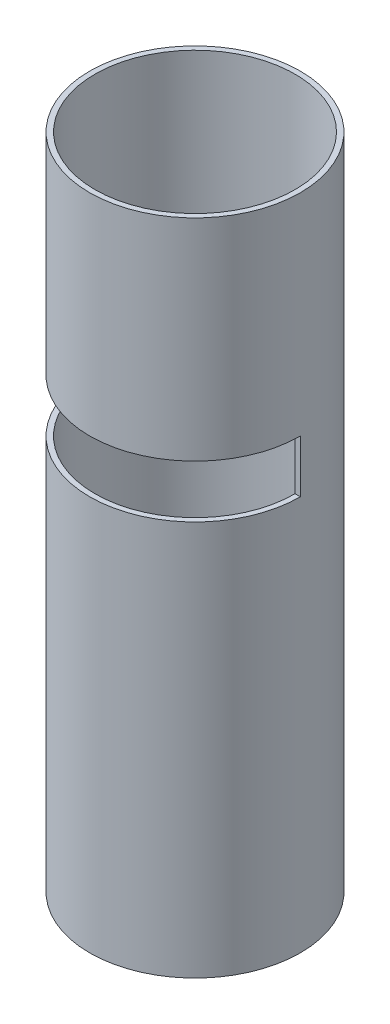
ISO-10303-21;
HEADER;
FILE_DESCRIPTION(('STEP AP214'),'2;1');
FILE_NAME('part.step','',(''),(''),'','','');
FILE_SCHEMA(('AUTOMOTIVE_DESIGN { 1 0 10303 214 1 1 1 1 }'));
ENDSEC;
DATA;
#1=APPLICATION_CONTEXT('core data for automotive mechanical design processes');
#2=APPLICATION_PROTOCOL_DEFINITION('international standard','automotive_design',2000,#1);
#3=PRODUCT_CONTEXT('',#1,'mechanical');
#4=PRODUCT('Part','Part','',(#3));
#5=PRODUCT_RELATED_PRODUCT_CATEGORY('part','',(#4));
#6=PRODUCT_DEFINITION_FORMATION('','',#4);
#7=PRODUCT_DEFINITION_CONTEXT('part definition',#1,'design');
#8=PRODUCT_DEFINITION('design','',#6,#7);
#9=PRODUCT_DEFINITION_SHAPE('','',#8);
#10=(LENGTH_UNIT() NAMED_UNIT(*) SI_UNIT(.MILLI.,.METRE.));
#11=(NAMED_UNIT(*) PLANE_ANGLE_UNIT() SI_UNIT($,.RADIAN.));
#12=(NAMED_UNIT(*) SI_UNIT($,.STERADIAN.) SOLID_ANGLE_UNIT());
#13=UNCERTAINTY_MEASURE_WITH_UNIT(LENGTH_MEASURE(1.E-05),#10,'distance_accuracy_value','');
#14=(GEOMETRIC_REPRESENTATION_CONTEXT(3) GLOBAL_UNCERTAINTY_ASSIGNED_CONTEXT((#13)) GLOBAL_UNIT_ASSIGNED_CONTEXT((#10,
#11,#12)) REPRESENTATION_CONTEXT('',''));
#15=CARTESIAN_POINT('',(0.,0.,0.));
#16=DIRECTION('',(0.,0.,1.));
#17=DIRECTION('',(1.,0.,0.));
#18=AXIS2_PLACEMENT_3D('',#15,#16,#17);
#19=CARTESIAN_POINT('',(0.,250.,0.));
#20=DIRECTION('',(0.,-1.,0.));
#21=DIRECTION('',(0.,0.,-1.));
#22=AXIS2_PLACEMENT_3D('',#19,#20,#21);
#23=CYLINDRICAL_SURFACE('',#22,40.);
#24=CARTESIAN_POINT('',(0.,250.,0.));
#25=DIRECTION('',(0.,1.,0.));
#26=DIRECTION('',(0.,0.,1.));
#27=AXIS2_PLACEMENT_3D('',#24,#25,#26);
#28=CIRCLE('',#27,40.);
#29=CARTESIAN_POINT('',(0.,250.,40.));
#30=VERTEX_POINT('',#29);
#31=EDGE_CURVE('E103',#30,#30,#28,.T.);
#32=ORIENTED_EDGE('',*,*,#31,.F.);
#33=EDGE_LOOP('',(#32));
#34=FACE_BOUND('',#33,.T.);
#35=CARTESIAN_POINT('',(0.,0.,0.));
#36=DIRECTION('',(0.,1.,0.));
#37=DIRECTION('',(0.,0.,1.));
#38=AXIS2_PLACEMENT_3D('',#35,#36,#37);
#39=CIRCLE('',#38,40.);
#40=CARTESIAN_POINT('',(0.,0.,40.));
#41=VERTEX_POINT('',#40);
#42=EDGE_CURVE('E100',#41,#41,#39,.T.);
#43=ORIENTED_EDGE('',*,*,#42,.T.);
#44=EDGE_LOOP('',(#43));
#45=FACE_BOUND('',#44,.T.);
#46=CARTESIAN_POINT('',(0.,150.,0.));
#47=DIRECTION('',(0.,1.,0.));
#48=DIRECTION('',(0.,0.,1.));
#49=AXIS2_PLACEMENT_3D('',#46,#47,#48);
#50=CIRCLE('',#49,40.);
#51=CARTESIAN_POINT('',(-40.,150.,0.));
#52=VERTEX_POINT('',#51);
#53=CARTESIAN_POINT('',(40.,150.,0.));
#54=VERTEX_POINT('',#53);
#55=EDGE_CURVE('E72',#52,#54,#50,.T.);
#56=ORIENTED_EDGE('',*,*,#55,.F.);
#57=DIRECTION('',(0.,-1.,0.));
#58=VECTOR('',#57,1.);
#59=CARTESIAN_POINT('',(-40.,170.,0.));
#60=LINE('',#59,#58);
#61=CARTESIAN_POINT('',(-40.,170.,0.));
#62=VERTEX_POINT('',#61);
#63=EDGE_CURVE('E76',#62,#52,#60,.T.);
#64=ORIENTED_EDGE('',*,*,#63,.F.);
#65=CARTESIAN_POINT('',(0.,170.,0.));
#66=DIRECTION('',(0.,-1.,0.));
#67=DIRECTION('',(0.,0.,-1.));
#68=AXIS2_PLACEMENT_3D('',#65,#66,#67);
#69=CIRCLE('',#68,40.);
#70=CARTESIAN_POINT('',(40.,170.,0.));
#71=VERTEX_POINT('',#70);
#72=EDGE_CURVE('E80',#71,#62,#69,.T.);
#73=ORIENTED_EDGE('',*,*,#72,.F.);
#74=DIRECTION('',(0.,1.,0.));
#75=VECTOR('',#74,1.);
#76=CARTESIAN_POINT('',(40.,170.,0.));
#77=LINE('',#76,#75);
#78=EDGE_CURVE('E77',#54,#71,#77,.T.);
#79=ORIENTED_EDGE('',*,*,#78,.F.);
#80=EDGE_LOOP('',(#56,#64,#73,#79));
#81=FACE_BOUND('',#80,.T.);
#82=ADVANCED_FACE('F33',(#34,#45,#81),#23,.T.);
#83=CARTESIAN_POINT('',(0.,250.,0.));
#84=DIRECTION('',(0.,-1.,0.));
#85=DIRECTION('',(0.,0.,-1.));
#86=AXIS2_PLACEMENT_3D('',#83,#84,#85);
#87=CYLINDRICAL_SURFACE('',#86,38.);
#88=CARTESIAN_POINT('',(0.,250.,0.));
#89=DIRECTION('',(0.,1.,0.));
#90=DIRECTION('',(0.,0.,1.));
#91=AXIS2_PLACEMENT_3D('',#88,#89,#90);
#92=CIRCLE('',#91,38.);
#93=CARTESIAN_POINT('',(0.,250.,38.));
#94=VERTEX_POINT('',#93);
#95=EDGE_CURVE('E97',#94,#94,#92,.T.);
#96=ORIENTED_EDGE('',*,*,#95,.T.);
#97=EDGE_LOOP('',(#96));
#98=FACE_BOUND('',#97,.T.);
#99=CARTESIAN_POINT('',(0.,0.,0.));
#100=DIRECTION('',(0.,1.,0.));
#101=DIRECTION('',(0.,0.,1.));
#102=AXIS2_PLACEMENT_3D('',#99,#100,#101);
#103=CIRCLE('',#102,38.);
#104=CARTESIAN_POINT('',(0.,0.,38.));
#105=VERTEX_POINT('',#104);
#106=EDGE_CURVE('E79',#105,#105,#103,.T.);
#107=ORIENTED_EDGE('',*,*,#106,.F.);
#108=EDGE_LOOP('',(#107));
#109=FACE_BOUND('',#108,.T.);
#110=CARTESIAN_POINT('',(0.,170.,0.));
#111=DIRECTION('',(0.,-1.,0.));
#112=DIRECTION('',(0.,0.,-1.));
#113=AXIS2_PLACEMENT_3D('',#110,#111,#112);
#114=CIRCLE('',#113,38.);
#115=CARTESIAN_POINT('',(38.,170.,0.));
#116=VERTEX_POINT('',#115);
#117=CARTESIAN_POINT('',(-38.,170.,0.));
#118=VERTEX_POINT('',#117);
#119=EDGE_CURVE('E111',#116,#118,#114,.T.);
#120=ORIENTED_EDGE('',*,*,#119,.T.);
#121=DIRECTION('',(0.,-1.,0.));
#122=VECTOR('',#121,1.);
#123=CARTESIAN_POINT('',(-38.,250.,0.));
#124=LINE('',#123,#122);
#125=CARTESIAN_POINT('',(-38.,150.,0.));
#126=VERTEX_POINT('',#125);
#127=EDGE_CURVE('E11',#118,#126,#124,.T.);
#128=ORIENTED_EDGE('',*,*,#127,.T.);
#129=CARTESIAN_POINT('',(0.,150.,0.));
#130=DIRECTION('',(0.,1.,0.));
#131=DIRECTION('',(0.,0.,1.));
#132=AXIS2_PLACEMENT_3D('',#129,#130,#131);
#133=CIRCLE('',#132,38.);
#134=CARTESIAN_POINT('',(38.,150.,0.));
#135=VERTEX_POINT('',#134);
#136=EDGE_CURVE('E40',#126,#135,#133,.T.);
#137=ORIENTED_EDGE('',*,*,#136,.T.);
#138=DIRECTION('',(0.,-1.,0.));
#139=VECTOR('',#138,1.);
#140=CARTESIAN_POINT('',(38.,250.,0.));
#141=LINE('',#140,#139);
#142=EDGE_CURVE('E106',#135,#116,#141,.F.);
#143=ORIENTED_EDGE('',*,*,#142,.T.);
#144=EDGE_LOOP('',(#120,#128,#137,#143));
#145=FACE_BOUND('',#144,.T.);
#146=ADVANCED_FACE('F114',(#98,#109,#145),#87,.F.);
#147=CARTESIAN_POINT('',(0.,250.,0.));
#148=DIRECTION('',(0.,1.,0.));
#149=DIRECTION('',(0.,0.,1.));
#150=AXIS2_PLACEMENT_3D('',#147,#148,#149);
#151=PLANE('',#150);
#152=ORIENTED_EDGE('',*,*,#31,.T.);
#153=EDGE_LOOP('',(#152));
#154=FACE_BOUND('',#153,.T.);
#155=ORIENTED_EDGE('',*,*,#95,.F.);
#156=EDGE_LOOP('',(#155));
#157=FACE_BOUND('',#156,.T.);
#158=ADVANCED_FACE('F132',(#154,#157),#151,.T.);
#159=CARTESIAN_POINT('',(0.,0.,0.));
#160=DIRECTION('',(0.,1.,0.));
#161=DIRECTION('',(0.,0.,1.));
#162=AXIS2_PLACEMENT_3D('',#159,#160,#161);
#163=PLANE('',#162);
#164=ORIENTED_EDGE('',*,*,#42,.F.);
#165=EDGE_LOOP('',(#164));
#166=FACE_BOUND('',#165,.T.);
#167=ORIENTED_EDGE('',*,*,#106,.T.);
#168=EDGE_LOOP('',(#167));
#169=FACE_BOUND('',#168,.T.);
#170=ADVANCED_FACE('F125',(#166,#169),#163,.F.);
#171=CARTESIAN_POINT('',(-40.,150.,40.));
#172=DIRECTION('',(0.,1.,0.));
#173=DIRECTION('',(0.,0.,1.));
#174=AXIS2_PLACEMENT_3D('',#171,#172,#173);
#175=PLANE('',#174);
#176=ORIENTED_EDGE('',*,*,#55,.T.);
#177=DIRECTION('',(1.,0.,0.));
#178=VECTOR('',#177,1.);
#179=CARTESIAN_POINT('',(-40.,150.,0.));
#180=LINE('',#179,#178);
#181=EDGE_CURVE('E47',#135,#54,#180,.T.);
#182=ORIENTED_EDGE('',*,*,#181,.F.);
#183=ORIENTED_EDGE('',*,*,#136,.F.);
#184=EDGE_CURVE('E83',#52,#126,#180,.T.);
#185=ORIENTED_EDGE('',*,*,#184,.F.);
#186=EDGE_LOOP('',(#176,#182,#183,#185));
#187=FACE_BOUND('',#186,.T.);
#188=ADVANCED_FACE('F84',(#187),#175,.T.);
#189=CARTESIAN_POINT('',(-40.,170.,40.));
#190=DIRECTION('',(0.,-1.,0.));
#191=DIRECTION('',(0.,0.,-1.));
#192=AXIS2_PLACEMENT_3D('',#189,#190,#191);
#193=PLANE('',#192);
#194=ORIENTED_EDGE('',*,*,#72,.T.);
#195=DIRECTION('',(-1.,0.,0.));
#196=VECTOR('',#195,1.);
#197=CARTESIAN_POINT('',(-40.,170.,0.));
#198=LINE('',#197,#196);
#199=EDGE_CURVE('E91',#118,#62,#198,.T.);
#200=ORIENTED_EDGE('',*,*,#199,.F.);
#201=ORIENTED_EDGE('',*,*,#119,.F.);
#202=EDGE_CURVE('E52',#71,#116,#198,.T.);
#203=ORIENTED_EDGE('',*,*,#202,.F.);
#204=EDGE_LOOP('',(#194,#200,#201,#203));
#205=FACE_BOUND('',#204,.T.);
#206=ADVANCED_FACE('F116',(#205),#193,.T.);
#207=CARTESIAN_POINT('',(0.,0.,0.));
#208=DIRECTION('',(0.,0.,1.));
#209=DIRECTION('',(1.,0.,0.));
#210=AXIS2_PLACEMENT_3D('',#207,#208,#209);
#211=PLANE('',#210);
#212=ORIENTED_EDGE('',*,*,#199,.T.);
#213=ORIENTED_EDGE('',*,*,#63,.T.);
#214=ORIENTED_EDGE('',*,*,#184,.T.);
#215=ORIENTED_EDGE('',*,*,#127,.F.);
#216=EDGE_LOOP('',(#212,#213,#214,#215));
#217=FACE_BOUND('',#216,.T.);
#218=ADVANCED_FACE('F89',(#217),#211,.T.);
#219=ORIENTED_EDGE('',*,*,#181,.T.);
#220=ORIENTED_EDGE('',*,*,#78,.T.);
#221=ORIENTED_EDGE('',*,*,#202,.T.);
#222=ORIENTED_EDGE('',*,*,#142,.F.);
#223=EDGE_LOOP('',(#219,#220,#221,#222));
#224=FACE_BOUND('',#223,.T.);
#225=ADVANCED_FACE('F123',(#224),#211,.T.);
#226=CLOSED_SHELL('',(#82,#146,#158,#170,#188,#206,#218,#225));
#227=MANIFOLD_SOLID_BREP('B2',#226);
#228=ADVANCED_BREP_SHAPE_REPRESENTATION('',(#18,#227),#14);
#229=SHAPE_DEFINITION_REPRESENTATION(#9,#228);
ENDSEC;
END-ISO-10303-21;
